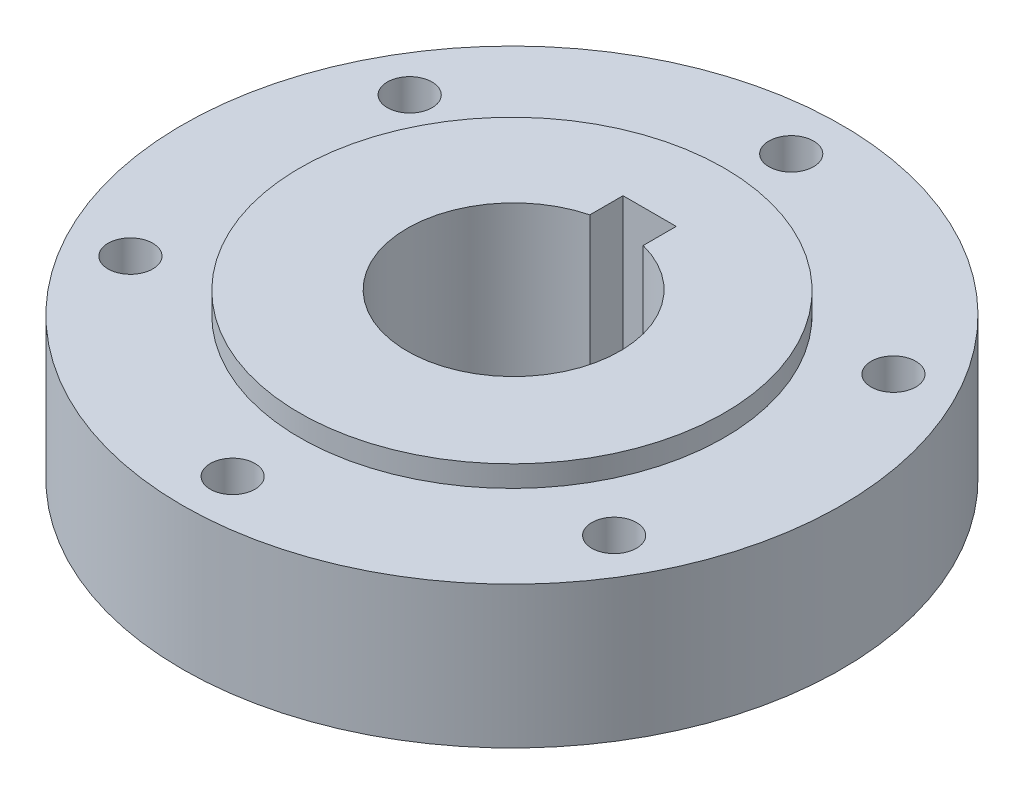
ISO-10303-21;
HEADER;
FILE_DESCRIPTION(('STEP AP214'),'2;1');
FILE_NAME('part.step','',(''),(''),'','','');
FILE_SCHEMA(('AUTOMOTIVE_DESIGN { 1 0 10303 214 1 1 1 1 }'));
ENDSEC;
DATA;
#1=APPLICATION_CONTEXT('core data for automotive mechanical design processes');
#2=APPLICATION_PROTOCOL_DEFINITION('international standard','automotive_design',2000,#1);
#3=PRODUCT_CONTEXT('',#1,'mechanical');
#4=PRODUCT('Part','Part','',(#3));
#5=PRODUCT_RELATED_PRODUCT_CATEGORY('part','',(#4));
#6=PRODUCT_DEFINITION_FORMATION('','',#4);
#7=PRODUCT_DEFINITION_CONTEXT('part definition',#1,'design');
#8=PRODUCT_DEFINITION('design','',#6,#7);
#9=PRODUCT_DEFINITION_SHAPE('','',#8);
#10=(LENGTH_UNIT() NAMED_UNIT(*) SI_UNIT(.MILLI.,.METRE.));
#11=(NAMED_UNIT(*) PLANE_ANGLE_UNIT() SI_UNIT($,.RADIAN.));
#12=(NAMED_UNIT(*) SI_UNIT($,.STERADIAN.) SOLID_ANGLE_UNIT());
#13=UNCERTAINTY_MEASURE_WITH_UNIT(LENGTH_MEASURE(1.E-05),#10,'distance_accuracy_value','');
#14=(GEOMETRIC_REPRESENTATION_CONTEXT(3) GLOBAL_UNCERTAINTY_ASSIGNED_CONTEXT((#13)) GLOBAL_UNIT_ASSIGNED_CONTEXT((#10,
#11,#12)) REPRESENTATION_CONTEXT('',''));
#15=CARTESIAN_POINT('',(0.,0.,0.));
#16=DIRECTION('',(0.,0.,1.));
#17=DIRECTION('',(1.,0.,0.));
#18=AXIS2_PLACEMENT_3D('',#15,#16,#17);
#19=CARTESIAN_POINT('',(0.,12.7,0.));
#20=DIRECTION('',(0.,-1.,0.));
#21=DIRECTION('',(0.,0.,-1.));
#22=AXIS2_PLACEMENT_3D('',#19,#20,#21);
#23=CYLINDRICAL_SURFACE('',#22,29.5);
#24=CARTESIAN_POINT('',(0.,12.7,0.));
#25=DIRECTION('',(0.,1.,0.));
#26=DIRECTION('',(0.,0.,1.));
#27=AXIS2_PLACEMENT_3D('',#24,#25,#26);
#28=CIRCLE('',#27,29.5);
#29=CARTESIAN_POINT('',(0.,12.7,29.5));
#30=VERTEX_POINT('',#29);
#31=EDGE_CURVE('E147',#30,#30,#28,.T.);
#32=ORIENTED_EDGE('',*,*,#31,.F.);
#33=EDGE_LOOP('',(#32));
#34=FACE_BOUND('',#33,.T.);
#35=CARTESIAN_POINT('',(0.,0.,0.));
#36=DIRECTION('',(0.,1.,0.));
#37=DIRECTION('',(0.,0.,1.));
#38=AXIS2_PLACEMENT_3D('',#35,#36,#37);
#39=CIRCLE('',#38,29.5);
#40=CARTESIAN_POINT('',(0.,0.,29.5));
#41=VERTEX_POINT('',#40);
#42=EDGE_CURVE('E143',#41,#41,#39,.T.);
#43=ORIENTED_EDGE('',*,*,#42,.T.);
#44=EDGE_LOOP('',(#43));
#45=FACE_BOUND('',#44,.T.);
#46=ADVANCED_FACE('F33',(#34,#45),#23,.T.);
#47=CARTESIAN_POINT('',(0.,12.7,0.));
#48=DIRECTION('',(0.,1.,0.));
#49=DIRECTION('',(0.,0.,1.));
#50=AXIS2_PLACEMENT_3D('',#47,#48,#49);
#51=PLANE('',#50);
#52=CARTESIAN_POINT('',(0.,12.7,-25.));
#53=DIRECTION('',(0.,1.,0.));
#54=DIRECTION('',(0.,0.,1.));
#55=AXIS2_PLACEMENT_3D('',#52,#53,#54);
#56=CIRCLE('',#55,2.);
#57=CARTESIAN_POINT('',(0.,12.7,-23.));
#58=VERTEX_POINT('',#57);
#59=EDGE_CURVE('E133',#58,#58,#56,.T.);
#60=ORIENTED_EDGE('',*,*,#59,.F.);
#61=EDGE_LOOP('',(#60));
#62=FACE_BOUND('',#61,.T.);
#63=CARTESIAN_POINT('',(-21.6506350946104,12.7,-12.4999999999991));
#64=DIRECTION('',(0.,1.,0.));
#65=DIRECTION('',(0.,0.,1.));
#66=AXIS2_PLACEMENT_3D('',#63,#64,#65);
#67=CIRCLE('',#66,2.00000000000108);
#68=CARTESIAN_POINT('',(-21.6506350946104,12.7,-10.499999999998));
#69=VERTEX_POINT('',#68);
#70=EDGE_CURVE('E130',#69,#69,#67,.T.);
#71=ORIENTED_EDGE('',*,*,#70,.F.);
#72=EDGE_LOOP('',(#71));
#73=FACE_BOUND('',#72,.T.);
#74=CARTESIAN_POINT('',(-21.6506350946094,12.7,12.5000000000009));
#75=DIRECTION('',(0.,1.,0.));
#76=DIRECTION('',(0.,0.,1.));
#77=AXIS2_PLACEMENT_3D('',#74,#75,#76);
#78=CIRCLE('',#77,2.00000000000203);
#79=CARTESIAN_POINT('',(-21.6506350946094,12.7,14.500000000003));
#80=VERTEX_POINT('',#79);
#81=EDGE_CURVE('E127',#80,#80,#78,.T.);
#82=ORIENTED_EDGE('',*,*,#81,.F.);
#83=EDGE_LOOP('',(#82));
#84=FACE_BOUND('',#83,.T.);
#85=CARTESIAN_POINT('',(2.12550497328456E-12,12.7,25.));
#86=DIRECTION('',(0.,1.,0.));
#87=DIRECTION('',(0.,0.,1.));
#88=AXIS2_PLACEMENT_3D('',#85,#86,#87);
#89=CIRCLE('',#88,2.0000000000022);
#90=CARTESIAN_POINT('',(2.12550497328456E-12,12.7,27.0000000000022));
#91=VERTEX_POINT('',#90);
#92=EDGE_CURVE('E124',#91,#91,#89,.T.);
#93=ORIENTED_EDGE('',*,*,#92,.F.);
#94=EDGE_LOOP('',(#93));
#95=FACE_BOUND('',#94,.T.);
#96=CARTESIAN_POINT('',(21.6506350946126,12.7,12.4999999999991));
#97=DIRECTION('',(0.,1.,0.));
#98=DIRECTION('',(0.,0.,1.));
#99=AXIS2_PLACEMENT_3D('',#96,#97,#98);
#100=CIRCLE('',#99,2.00000000000137);
#101=CARTESIAN_POINT('',(21.6506350946126,12.7,14.5000000000005));
#102=VERTEX_POINT('',#101);
#103=EDGE_CURVE('E121',#102,#102,#100,.T.);
#104=ORIENTED_EDGE('',*,*,#103,.F.);
#105=EDGE_LOOP('',(#104));
#106=FACE_BOUND('',#105,.T.);
#107=CARTESIAN_POINT('',(21.6506350946115,12.7,-12.5000000000009));
#108=DIRECTION('',(0.,1.,0.));
#109=DIRECTION('',(0.,0.,1.));
#110=AXIS2_PLACEMENT_3D('',#107,#108,#109);
#111=CIRCLE('',#110,2.0000000000003);
#112=CARTESIAN_POINT('',(21.6506350946115,12.7,-10.5000000000006));
#113=VERTEX_POINT('',#112);
#114=EDGE_CURVE('E104',#113,#113,#111,.T.);
#115=ORIENTED_EDGE('',*,*,#114,.F.);
#116=EDGE_LOOP('',(#115));
#117=FACE_BOUND('',#116,.T.);
#118=CARTESIAN_POINT('',(0.,12.7,0.));
#119=DIRECTION('',(0.,1.,0.));
#120=DIRECTION('',(0.,0.,1.));
#121=AXIS2_PLACEMENT_3D('',#118,#119,#120);
#122=CIRCLE('',#121,19.);
#123=CARTESIAN_POINT('',(0.,12.7,-19.));
#124=VERTEX_POINT('',#123);
#125=EDGE_CURVE('E144',#124,#124,#122,.T.);
#126=ORIENTED_EDGE('',*,*,#125,.F.);
#127=EDGE_LOOP('',(#126));
#128=FACE_BOUND('',#127,.T.);
#129=ORIENTED_EDGE('',*,*,#31,.T.);
#130=EDGE_LOOP('',(#129));
#131=FACE_BOUND('',#130,.T.);
#132=ADVANCED_FACE('F171',(#62,#73,#84,#95,#106,#117,#128,#131),#51,.T.);
#133=CARTESIAN_POINT('',(0.,0.,0.));
#134=DIRECTION('',(0.,1.,0.));
#135=DIRECTION('',(0.,0.,1.));
#136=AXIS2_PLACEMENT_3D('',#133,#134,#135);
#137=PLANE('',#136);
#138=CARTESIAN_POINT('',(0.,0.,-25.));
#139=DIRECTION('',(0.,1.,0.));
#140=DIRECTION('',(0.,0.,1.));
#141=AXIS2_PLACEMENT_3D('',#138,#139,#140);
#142=CIRCLE('',#141,2.);
#143=CARTESIAN_POINT('',(0.,0.,-23.));
#144=VERTEX_POINT('',#143);
#145=EDGE_CURVE('E101',#144,#144,#142,.T.);
#146=ORIENTED_EDGE('',*,*,#145,.T.);
#147=EDGE_LOOP('',(#146));
#148=FACE_BOUND('',#147,.T.);
#149=CARTESIAN_POINT('',(-21.6506350946104,0.,-12.4999999999991));
#150=DIRECTION('',(0.,1.,0.));
#151=DIRECTION('',(0.,0.,1.));
#152=AXIS2_PLACEMENT_3D('',#149,#150,#151);
#153=CIRCLE('',#152,2.00000000000108);
#154=CARTESIAN_POINT('',(-21.6506350946104,0.,-10.499999999998));
#155=VERTEX_POINT('',#154);
#156=EDGE_CURVE('E99',#155,#155,#153,.T.);
#157=ORIENTED_EDGE('',*,*,#156,.T.);
#158=EDGE_LOOP('',(#157));
#159=FACE_BOUND('',#158,.T.);
#160=CARTESIAN_POINT('',(-21.6506350946094,0.,12.5000000000009));
#161=DIRECTION('',(0.,1.,0.));
#162=DIRECTION('',(0.,0.,1.));
#163=AXIS2_PLACEMENT_3D('',#160,#161,#162);
#164=CIRCLE('',#163,2.00000000000203);
#165=CARTESIAN_POINT('',(-21.6506350946094,0.,14.500000000003));
#166=VERTEX_POINT('',#165);
#167=EDGE_CURVE('E108',#166,#166,#164,.T.);
#168=ORIENTED_EDGE('',*,*,#167,.T.);
#169=EDGE_LOOP('',(#168));
#170=FACE_BOUND('',#169,.T.);
#171=CARTESIAN_POINT('',(2.12550497328456E-12,0.,25.));
#172=DIRECTION('',(0.,1.,0.));
#173=DIRECTION('',(0.,0.,1.));
#174=AXIS2_PLACEMENT_3D('',#171,#172,#173);
#175=CIRCLE('',#174,2.0000000000022);
#176=CARTESIAN_POINT('',(2.12550497328456E-12,0.,27.0000000000022));
#177=VERTEX_POINT('',#176);
#178=EDGE_CURVE('E114',#177,#177,#175,.T.);
#179=ORIENTED_EDGE('',*,*,#178,.T.);
#180=EDGE_LOOP('',(#179));
#181=FACE_BOUND('',#180,.T.);
#182=CARTESIAN_POINT('',(21.6506350946126,0.,12.4999999999991));
#183=DIRECTION('',(0.,1.,0.));
#184=DIRECTION('',(0.,0.,1.));
#185=AXIS2_PLACEMENT_3D('',#182,#183,#184);
#186=CIRCLE('',#185,2.00000000000137);
#187=CARTESIAN_POINT('',(21.6506350946126,0.,14.5000000000005));
#188=VERTEX_POINT('',#187);
#189=EDGE_CURVE('E111',#188,#188,#186,.T.);
#190=ORIENTED_EDGE('',*,*,#189,.T.);
#191=EDGE_LOOP('',(#190));
#192=FACE_BOUND('',#191,.T.);
#193=CARTESIAN_POINT('',(21.6506350946115,0.,-12.5000000000009));
#194=DIRECTION('',(0.,1.,0.));
#195=DIRECTION('',(0.,0.,1.));
#196=AXIS2_PLACEMENT_3D('',#193,#194,#195);
#197=CIRCLE('',#196,2.0000000000003);
#198=CARTESIAN_POINT('',(21.6506350946115,0.,-10.5000000000006));
#199=VERTEX_POINT('',#198);
#200=EDGE_CURVE('E105',#199,#199,#197,.T.);
#201=ORIENTED_EDGE('',*,*,#200,.T.);
#202=EDGE_LOOP('',(#201));
#203=FACE_BOUND('',#202,.T.);
#204=DIRECTION('',(-1.,0.,0.));
#205=VECTOR('',#204,1.);
#206=CARTESIAN_POINT('',(-2.38125,0.,-12.3257131302605));
#207=LINE('',#206,#205);
#208=CARTESIAN_POINT('',(2.38125,0.,-12.3257131302605));
#209=VERTEX_POINT('',#208);
#210=CARTESIAN_POINT('',(-2.38125,0.,-12.3257131302605));
#211=VERTEX_POINT('',#210);
#212=EDGE_CURVE('E79',#209,#211,#207,.T.);
#213=ORIENTED_EDGE('',*,*,#212,.T.);
#214=DIRECTION('',(0.,0.,1.));
#215=VECTOR('',#214,1.);
#216=CARTESIAN_POINT('',(-2.38125,0.,-12.3257131302605));
#217=LINE('',#216,#215);
#218=CARTESIAN_POINT('',(-2.38125,0.,-9.35832263365372));
#219=VERTEX_POINT('',#218);
#220=EDGE_CURVE('E90',#211,#219,#217,.T.);
#221=ORIENTED_EDGE('',*,*,#220,.T.);
#222=CARTESIAN_POINT('',(0.0103286940028721,0.,-0.138454068951111));
#223=DIRECTION('',(0.,1.,0.));
#224=DIRECTION('',(0.,0.,1.));
#225=AXIS2_PLACEMENT_3D('',#222,#223,#224);
#226=CIRCLE('',#225,9.525);
#227=CARTESIAN_POINT('',(2.38125,0.,-9.36365635186983));
#228=VERTEX_POINT('',#227);
#229=EDGE_CURVE('E89',#219,#228,#226,.T.);
#230=ORIENTED_EDGE('',*,*,#229,.T.);
#231=DIRECTION('',(0.,0.,-1.));
#232=VECTOR('',#231,1.);
#233=CARTESIAN_POINT('',(2.38125,0.,-12.3257131302605));
#234=LINE('',#233,#232);
#235=EDGE_CURVE('E47',#228,#209,#234,.T.);
#236=ORIENTED_EDGE('',*,*,#235,.T.);
#237=EDGE_LOOP('',(#213,#221,#230,#236));
#238=FACE_BOUND('',#237,.T.);
#239=ORIENTED_EDGE('',*,*,#42,.F.);
#240=EDGE_LOOP('',(#239));
#241=FACE_BOUND('',#240,.T.);
#242=ADVANCED_FACE('F86',(#148,#159,#170,#181,#192,#203,#238,#241),#137,.F.);
#243=CARTESIAN_POINT('',(0.,14.605,0.));
#244=DIRECTION('',(0.,-1.,0.));
#245=DIRECTION('',(0.,0.,-1.));
#246=AXIS2_PLACEMENT_3D('',#243,#244,#245);
#247=CYLINDRICAL_SURFACE('',#246,19.);
#248=CARTESIAN_POINT('',(0.,14.605,0.));
#249=DIRECTION('',(0.,1.,0.));
#250=DIRECTION('',(0.,0.,1.));
#251=AXIS2_PLACEMENT_3D('',#248,#249,#250);
#252=CIRCLE('',#251,19.);
#253=CARTESIAN_POINT('',(0.,14.605,-19.));
#254=VERTEX_POINT('',#253);
#255=EDGE_CURVE('E140',#254,#254,#252,.T.);
#256=CARTESIAN_POINT('',(0.,14.605,-19.));
#257=CARTESIAN_POINT('',(0.,14.58515625,-19.));
#258=CARTESIAN_POINT('',(0.,14.5653125,-19.));
#259=CARTESIAN_POINT('',(0.,14.525625,-19.));
#260=CARTESIAN_POINT('',(0.,14.50578125,-19.));
#261=CARTESIAN_POINT('',(0.,14.46609375,-19.));
#262=CARTESIAN_POINT('',(0.,14.44625,-19.));
#263=CARTESIAN_POINT('',(0.,14.4065625,-19.));
#264=CARTESIAN_POINT('',(0.,14.38671875,-19.));
#265=CARTESIAN_POINT('',(0.,14.34703125,-19.));
#266=CARTESIAN_POINT('',(0.,14.3271875,-19.));
#267=CARTESIAN_POINT('',(0.,14.2875,-19.));
#268=CARTESIAN_POINT('',(0.,14.26765625,-19.));
#269=CARTESIAN_POINT('',(0.,14.22796875,-19.));
#270=CARTESIAN_POINT('',(0.,14.208125,-19.));
#271=CARTESIAN_POINT('',(0.,14.1684375,-19.));
#272=CARTESIAN_POINT('',(0.,14.14859375,-19.));
#273=CARTESIAN_POINT('',(0.,14.10890625,-19.));
#274=CARTESIAN_POINT('',(0.,14.0890625,-19.));
#275=CARTESIAN_POINT('',(0.,14.049375,-19.));
#276=CARTESIAN_POINT('',(0.,14.02953125,-19.));
#277=CARTESIAN_POINT('',(0.,13.98984375,-19.));
#278=CARTESIAN_POINT('',(0.,13.97,-19.));
#279=CARTESIAN_POINT('',(0.,13.9303125,-19.));
#280=CARTESIAN_POINT('',(0.,13.91046875,-19.));
#281=CARTESIAN_POINT('',(0.,13.87078125,-19.));
#282=CARTESIAN_POINT('',(0.,13.8509375,-19.));
#283=CARTESIAN_POINT('',(0.,13.81125,-19.));
#284=CARTESIAN_POINT('',(0.,13.79140625,-19.));
#285=CARTESIAN_POINT('',(0.,13.75171875,-19.));
#286=CARTESIAN_POINT('',(0.,13.731875,-19.));
#287=CARTESIAN_POINT('',(0.,13.6921875,-19.));
#288=CARTESIAN_POINT('',(0.,13.67234375,-19.));
#289=CARTESIAN_POINT('',(0.,13.63265625,-19.));
#290=CARTESIAN_POINT('',(0.,13.6128125,-19.));
#291=CARTESIAN_POINT('',(0.,13.573125,-19.));
#292=CARTESIAN_POINT('',(0.,13.55328125,-19.));
#293=CARTESIAN_POINT('',(0.,13.51359375,-19.));
#294=CARTESIAN_POINT('',(0.,13.49375,-19.));
#295=CARTESIAN_POINT('',(0.,13.4540625,-19.));
#296=CARTESIAN_POINT('',(0.,13.43421875,-19.));
#297=CARTESIAN_POINT('',(0.,13.39453125,-19.));
#298=CARTESIAN_POINT('',(0.,13.3746875,-19.));
#299=CARTESIAN_POINT('',(0.,13.335,-19.));
#300=CARTESIAN_POINT('',(0.,13.31515625,-19.));
#301=CARTESIAN_POINT('',(0.,13.27546875,-19.));
#302=CARTESIAN_POINT('',(0.,13.255625,-19.));
#303=CARTESIAN_POINT('',(0.,13.2159375,-19.));
#304=CARTESIAN_POINT('',(0.,13.19609375,-19.));
#305=CARTESIAN_POINT('',(0.,13.15640625,-19.));
#306=CARTESIAN_POINT('',(0.,13.1365625,-19.));
#307=CARTESIAN_POINT('',(0.,13.096875,-19.));
#308=CARTESIAN_POINT('',(0.,13.07703125,-19.));
#309=CARTESIAN_POINT('',(0.,13.03734375,-19.));
#310=CARTESIAN_POINT('',(0.,13.0175,-19.));
#311=CARTESIAN_POINT('',(0.,12.9778125,-19.));
#312=CARTESIAN_POINT('',(0.,12.95796875,-19.));
#313=CARTESIAN_POINT('',(0.,12.91828125,-19.));
#314=CARTESIAN_POINT('',(0.,12.8984375,-19.));
#315=CARTESIAN_POINT('',(0.,12.85875,-19.));
#316=CARTESIAN_POINT('',(0.,12.83890625,-19.));
#317=CARTESIAN_POINT('',(0.,12.79921875,-19.));
#318=CARTESIAN_POINT('',(0.,12.779375,-19.));
#319=CARTESIAN_POINT('',(0.,12.7396875,-19.));
#320=CARTESIAN_POINT('',(0.,12.71984375,-19.));
#321=CARTESIAN_POINT('',(0.,12.7,-19.));
#322=B_SPLINE_CURVE_WITH_KNOTS('',3,(#256,#257,#258,#259,#260,#261,#262,#263,#264,#265,#266,
#267,#268,#269,#270,#271,#272,#273,#274,#275,#276,#277,#278,#279,#280,#281,#282,#283,#284,#285,
#286,#287,#288,#289,#290,#291,#292,#293,#294,#295,#296,#297,#298,#299,#300,#301,#302,#303,#304,
#305,#306,#307,#308,#309,#310,#311,#312,#313,#314,#315,#316,#317,#318,#319,#320,#321),
.UNSPECIFIED.,.F.,.F.,(4,2,2,2,2,2,2,2,2,2,2,2,2,2,2,2,2,2,2,2,2,2,2,2,2,2,2,2,2,2,2,2,4),(0.,
0.0595312499999997,0.119062499999999,0.178593749999999,0.238124999999999,0.297656249999998,
0.3571875,0.41671875,0.476249999999999,0.535781249999999,0.595312499999999,0.65484375,0.714375,
0.773906249999999,0.833437499999999,0.892968749999999,0.9525,1.01203125,1.0715625,1.13109375,
1.190625,1.25015625,1.3096875,1.36921875,1.42875,1.48828125,1.5478125,1.60734375,1.666875,
1.72640625,1.7859375,1.84546875,1.905),.UNSPECIFIED.);
#323=EDGE_CURVE('BSEAM183',#254,#124,#322,.T.);
#324=ORIENTED_EDGE('',*,*,#255,.F.);
#325=ORIENTED_EDGE('',*,*,#125,.T.);
#326=ORIENTED_EDGE('',*,*,#323,.T.);
#327=ORIENTED_EDGE('',*,*,#323,.F.);
#328=EDGE_LOOP('',(#324,#326,#325,#327));
#329=FACE_BOUND('',#328,.T.);
#330=ADVANCED_FACE('F183',(#329),#247,.T.);
#331=CARTESIAN_POINT('',(0.,14.605,0.));
#332=DIRECTION('',(0.,1.,0.));
#333=DIRECTION('',(0.,0.,1.));
#334=AXIS2_PLACEMENT_3D('',#331,#332,#333);
#335=PLANE('',#334);
#336=DIRECTION('',(0.,0.,1.));
#337=VECTOR('',#336,1.);
#338=CARTESIAN_POINT('',(-2.38125,14.605,-12.3257131302605));
#339=LINE('',#338,#337);
#340=CARTESIAN_POINT('',(-2.38125,14.605,-12.3257131302605));
#341=VERTEX_POINT('',#340);
#342=CARTESIAN_POINT('',(-2.38125,14.605,-9.35832263365372));
#343=VERTEX_POINT('',#342);
#344=EDGE_CURVE('E95',#341,#343,#339,.T.);
#345=ORIENTED_EDGE('',*,*,#344,.F.);
#346=DIRECTION('',(-1.,0.,0.));
#347=VECTOR('',#346,1.);
#348=CARTESIAN_POINT('',(-2.38125,14.605,-12.3257131302605));
#349=LINE('',#348,#347);
#350=CARTESIAN_POINT('',(2.38125,14.605,-12.3257131302605));
#351=VERTEX_POINT('',#350);
#352=EDGE_CURVE('E92',#351,#341,#349,.T.);
#353=ORIENTED_EDGE('',*,*,#352,.F.);
#354=DIRECTION('',(0.,0.,-1.));
#355=VECTOR('',#354,1.);
#356=CARTESIAN_POINT('',(2.38125,14.605,-12.3257131302605));
#357=LINE('',#356,#355);
#358=CARTESIAN_POINT('',(2.38125,14.605,-9.36365635186983));
#359=VERTEX_POINT('',#358);
#360=EDGE_CURVE('E74',#359,#351,#357,.T.);
#361=ORIENTED_EDGE('',*,*,#360,.F.);
#362=CARTESIAN_POINT('',(0.0103286940028721,14.605,-0.138454068951111));
#363=DIRECTION('',(0.,1.,0.));
#364=DIRECTION('',(0.,0.,1.));
#365=AXIS2_PLACEMENT_3D('',#362,#363,#364);
#366=CIRCLE('',#365,9.525);
#367=EDGE_CURVE('E136',#343,#359,#366,.T.);
#368=ORIENTED_EDGE('',*,*,#367,.F.);
#369=EDGE_LOOP('',(#345,#353,#361,#368));
#370=FACE_BOUND('',#369,.T.);
#371=ORIENTED_EDGE('',*,*,#255,.T.);
#372=EDGE_LOOP('',(#371));
#373=FACE_BOUND('',#372,.T.);
#374=ADVANCED_FACE('F156',(#370,#373),#335,.T.);
#375=CARTESIAN_POINT('',(0.0103286940028721,14.605,-0.138454068951111));
#376=DIRECTION('',(0.,1.,0.));
#377=DIRECTION('',(0.,0.,1.));
#378=AXIS2_PLACEMENT_3D('',#375,#376,#377);
#379=CYLINDRICAL_SURFACE('',#378,9.525);
#380=ORIENTED_EDGE('',*,*,#229,.F.);
#381=DIRECTION('',(0.,1.,0.));
#382=VECTOR('',#381,1.);
#383=CARTESIAN_POINT('',(-2.38125,14.605,-9.35832263365372));
#384=LINE('',#383,#382);
#385=EDGE_CURVE('E11',#219,#343,#384,.T.);
#386=ORIENTED_EDGE('',*,*,#385,.T.);
#387=ORIENTED_EDGE('',*,*,#367,.T.);
#388=DIRECTION('',(0.,1.,0.));
#389=VECTOR('',#388,1.);
#390=CARTESIAN_POINT('',(2.38125,14.605,-9.36365635186983));
#391=LINE('',#390,#389);
#392=EDGE_CURVE('E40',#359,#228,#391,.F.);
#393=ORIENTED_EDGE('',*,*,#392,.T.);
#394=EDGE_LOOP('',(#380,#386,#387,#393));
#395=FACE_BOUND('',#394,.T.);
#396=ADVANCED_FACE('F152',(#395),#379,.F.);
#397=CARTESIAN_POINT('',(21.6506350946115,0.,-12.5000000000009));
#398=DIRECTION('',(0.,1.,0.));
#399=DIRECTION('',(0.,0.,1.));
#400=AXIS2_PLACEMENT_3D('',#397,#398,#399);
#401=CYLINDRICAL_SURFACE('',#400,2.0000000000003);
#402=ORIENTED_EDGE('',*,*,#114,.T.);
#403=EDGE_LOOP('',(#402));
#404=FACE_BOUND('',#403,.T.);
#405=ORIENTED_EDGE('',*,*,#200,.F.);
#406=EDGE_LOOP('',(#405));
#407=FACE_BOUND('',#406,.T.);
#408=ADVANCED_FACE('F197',(#404,#407),#401,.F.);
#409=CARTESIAN_POINT('',(21.6506350946126,0.,12.4999999999991));
#410=DIRECTION('',(0.,1.,0.));
#411=DIRECTION('',(0.,0.,1.));
#412=AXIS2_PLACEMENT_3D('',#409,#410,#411);
#413=CYLINDRICAL_SURFACE('',#412,2.00000000000137);
#414=ORIENTED_EDGE('',*,*,#103,.T.);
#415=EDGE_LOOP('',(#414));
#416=FACE_BOUND('',#415,.T.);
#417=ORIENTED_EDGE('',*,*,#189,.F.);
#418=EDGE_LOOP('',(#417));
#419=FACE_BOUND('',#418,.T.);
#420=ADVANCED_FACE('F205',(#416,#419),#413,.F.);
#421=CARTESIAN_POINT('',(2.12550497328456E-12,0.,25.));
#422=DIRECTION('',(0.,1.,0.));
#423=DIRECTION('',(0.,0.,1.));
#424=AXIS2_PLACEMENT_3D('',#421,#422,#423);
#425=CYLINDRICAL_SURFACE('',#424,2.0000000000022);
#426=ORIENTED_EDGE('',*,*,#92,.T.);
#427=EDGE_LOOP('',(#426));
#428=FACE_BOUND('',#427,.T.);
#429=ORIENTED_EDGE('',*,*,#178,.F.);
#430=EDGE_LOOP('',(#429));
#431=FACE_BOUND('',#430,.T.);
#432=ADVANCED_FACE('F201',(#428,#431),#425,.F.);
#433=CARTESIAN_POINT('',(-21.6506350946094,0.,12.5000000000009));
#434=DIRECTION('',(0.,1.,0.));
#435=DIRECTION('',(0.,0.,1.));
#436=AXIS2_PLACEMENT_3D('',#433,#434,#435);
#437=CYLINDRICAL_SURFACE('',#436,2.00000000000203);
#438=ORIENTED_EDGE('',*,*,#81,.T.);
#439=EDGE_LOOP('',(#438));
#440=FACE_BOUND('',#439,.T.);
#441=ORIENTED_EDGE('',*,*,#167,.F.);
#442=EDGE_LOOP('',(#441));
#443=FACE_BOUND('',#442,.T.);
#444=ADVANCED_FACE('F198',(#440,#443),#437,.F.);
#445=CARTESIAN_POINT('',(-21.6506350946104,0.,-12.4999999999991));
#446=DIRECTION('',(0.,1.,0.));
#447=DIRECTION('',(0.,0.,1.));
#448=AXIS2_PLACEMENT_3D('',#445,#446,#447);
#449=CYLINDRICAL_SURFACE('',#448,2.00000000000108);
#450=ORIENTED_EDGE('',*,*,#70,.T.);
#451=EDGE_LOOP('',(#450));
#452=FACE_BOUND('',#451,.T.);
#453=ORIENTED_EDGE('',*,*,#156,.F.);
#454=EDGE_LOOP('',(#453));
#455=FACE_BOUND('',#454,.T.);
#456=ADVANCED_FACE('F167',(#452,#455),#449,.F.);
#457=CARTESIAN_POINT('',(0.,0.,-25.));
#458=DIRECTION('',(0.,1.,0.));
#459=DIRECTION('',(0.,0.,1.));
#460=AXIS2_PLACEMENT_3D('',#457,#458,#459);
#461=CYLINDRICAL_SURFACE('',#460,2.);
#462=ORIENTED_EDGE('',*,*,#59,.T.);
#463=EDGE_LOOP('',(#462));
#464=FACE_BOUND('',#463,.T.);
#465=ORIENTED_EDGE('',*,*,#145,.F.);
#466=EDGE_LOOP('',(#465));
#467=FACE_BOUND('',#466,.T.);
#468=ADVANCED_FACE('F160',(#464,#467),#461,.F.);
#469=CARTESIAN_POINT('',(-2.38125,0.,-12.3257131302605));
#470=DIRECTION('',(-1.,0.,0.));
#471=DIRECTION('',(0.,0.,1.));
#472=AXIS2_PLACEMENT_3D('',#469,#470,#471);
#473=PLANE('',#472);
#474=ORIENTED_EDGE('',*,*,#220,.F.);
#475=DIRECTION('',(0.,1.,0.));
#476=VECTOR('',#475,1.);
#477=CARTESIAN_POINT('',(-2.38125,0.,-12.3257131302605));
#478=LINE('',#477,#476);
#479=EDGE_CURVE('E78',#211,#341,#478,.T.);
#480=ORIENTED_EDGE('',*,*,#479,.T.);
#481=ORIENTED_EDGE('',*,*,#344,.T.);
#482=ORIENTED_EDGE('',*,*,#385,.F.);
#483=EDGE_LOOP('',(#474,#480,#481,#482));
#484=FACE_BOUND('',#483,.T.);
#485=ADVANCED_FACE('F158',(#484),#473,.F.);
#486=CARTESIAN_POINT('',(2.38125,0.,-12.3257131302605));
#487=DIRECTION('',(1.,0.,0.));
#488=DIRECTION('',(0.,0.,-1.));
#489=AXIS2_PLACEMENT_3D('',#486,#487,#488);
#490=PLANE('',#489);
#491=ORIENTED_EDGE('',*,*,#360,.T.);
#492=DIRECTION('',(0.,1.,0.));
#493=VECTOR('',#492,1.);
#494=CARTESIAN_POINT('',(2.38125,0.,-12.3257131302605));
#495=LINE('',#494,#493);
#496=EDGE_CURVE('E70',#209,#351,#495,.T.);
#497=ORIENTED_EDGE('',*,*,#496,.F.);
#498=ORIENTED_EDGE('',*,*,#235,.F.);
#499=ORIENTED_EDGE('',*,*,#392,.F.);
#500=EDGE_LOOP('',(#491,#497,#498,#499));
#501=FACE_BOUND('',#500,.T.);
#502=ADVANCED_FACE('F72',(#501),#490,.F.);
#503=CARTESIAN_POINT('',(-2.38125,0.,-12.3257131302605));
#504=DIRECTION('',(0.,0.,-1.));
#505=DIRECTION('',(-1.,0.,0.));
#506=AXIS2_PLACEMENT_3D('',#503,#504,#505);
#507=PLANE('',#506);
#508=ORIENTED_EDGE('',*,*,#352,.T.);
#509=ORIENTED_EDGE('',*,*,#479,.F.);
#510=ORIENTED_EDGE('',*,*,#212,.F.);
#511=ORIENTED_EDGE('',*,*,#496,.T.);
#512=EDGE_LOOP('',(#508,#509,#510,#511));
#513=FACE_BOUND('',#512,.T.);
#514=ADVANCED_FACE('F82',(#513),#507,.F.);
#515=CLOSED_SHELL('',(#46,#132,#242,#330,#374,#396,#408,#420,#432,#444,#456,#468,#485,#502,#514));
#516=MANIFOLD_SOLID_BREP('B2',#515);
#517=ADVANCED_BREP_SHAPE_REPRESENTATION('',(#18,#516),#14);
#518=SHAPE_DEFINITION_REPRESENTATION(#9,#517);
ENDSEC;
END-ISO-10303-21;
